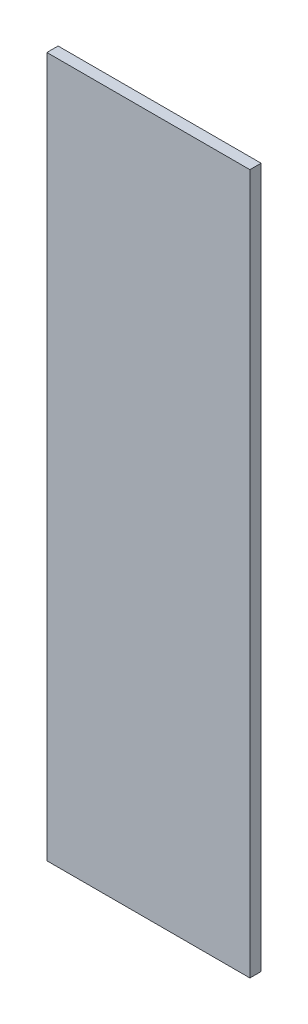
ISO-10303-21;
HEADER;
FILE_DESCRIPTION(('STEP AP214'),'2;1');
FILE_NAME('part.step','',(''),(''),'','','');
FILE_SCHEMA(('AUTOMOTIVE_DESIGN { 1 0 10303 214 1 1 1 1 }'));
ENDSEC;
DATA;
#1=APPLICATION_CONTEXT('core data for automotive mechanical design processes');
#2=APPLICATION_PROTOCOL_DEFINITION('international standard','automotive_design',2000,#1);
#3=PRODUCT_CONTEXT('',#1,'mechanical');
#4=PRODUCT('Part','Part','',(#3));
#5=PRODUCT_RELATED_PRODUCT_CATEGORY('part','',(#4));
#6=PRODUCT_DEFINITION_FORMATION('','',#4);
#7=PRODUCT_DEFINITION_CONTEXT('part definition',#1,'design');
#8=PRODUCT_DEFINITION('design','',#6,#7);
#9=PRODUCT_DEFINITION_SHAPE('','',#8);
#10=(LENGTH_UNIT() NAMED_UNIT(*) SI_UNIT(.MILLI.,.METRE.));
#11=(NAMED_UNIT(*) PLANE_ANGLE_UNIT() SI_UNIT($,.RADIAN.));
#12=(NAMED_UNIT(*) SI_UNIT($,.STERADIAN.) SOLID_ANGLE_UNIT());
#13=UNCERTAINTY_MEASURE_WITH_UNIT(LENGTH_MEASURE(1.E-05),#10,'distance_accuracy_value','');
#14=(GEOMETRIC_REPRESENTATION_CONTEXT(3) GLOBAL_UNCERTAINTY_ASSIGNED_CONTEXT((#13)) GLOBAL_UNIT_ASSIGNED_CONTEXT((#10,
#11,#12)) REPRESENTATION_CONTEXT('',''));
#15=CARTESIAN_POINT('',(0.,0.,0.));
#16=DIRECTION('',(0.,0.,1.));
#17=DIRECTION('',(1.,0.,0.));
#18=AXIS2_PLACEMENT_3D('',#15,#16,#17);
#19=CARTESIAN_POINT('',(0.,0.,1.6));
#20=DIRECTION('',(1.,0.,0.));
#21=DIRECTION('',(0.,1.,0.));
#22=AXIS2_PLACEMENT_3D('',#19,#20,#21);
#23=PLANE('',#22);
#24=DIRECTION('',(0.,-1.,0.));
#25=VECTOR('',#24,1.);
#26=CARTESIAN_POINT('',(0.,0.,0.));
#27=LINE('',#26,#25);
#28=CARTESIAN_POINT('',(0.,100.,0.));
#29=VERTEX_POINT('',#28);
#30=CARTESIAN_POINT('',(0.,0.,0.));
#31=VERTEX_POINT('',#30);
#32=EDGE_CURVE('E99',#29,#31,#27,.T.);
#33=ORIENTED_EDGE('',*,*,#32,.T.);
#34=DIRECTION('',(0.,0.,-1.));
#35=VECTOR('',#34,1.);
#36=CARTESIAN_POINT('',(0.,0.,1.6));
#37=LINE('',#36,#35);
#38=CARTESIAN_POINT('',(0.,0.,1.6));
#39=VERTEX_POINT('',#38);
#40=EDGE_CURVE('E11',#39,#31,#37,.T.);
#41=ORIENTED_EDGE('',*,*,#40,.F.);
#42=DIRECTION('',(0.,-1.,0.));
#43=VECTOR('',#42,1.);
#44=CARTESIAN_POINT('',(0.,0.,1.6));
#45=LINE('',#44,#43);
#46=CARTESIAN_POINT('',(0.,100.,1.6));
#47=VERTEX_POINT('',#46);
#48=EDGE_CURVE('E87',#47,#39,#45,.T.);
#49=ORIENTED_EDGE('',*,*,#48,.F.);
#50=DIRECTION('',(0.,0.,-1.));
#51=VECTOR('',#50,1.);
#52=CARTESIAN_POINT('',(0.,100.,1.6));
#53=LINE('',#52,#51);
#54=EDGE_CURVE('E95',#47,#29,#53,.T.);
#55=ORIENTED_EDGE('',*,*,#54,.T.);
#56=EDGE_LOOP('',(#33,#41,#49,#55));
#57=FACE_BOUND('',#56,.T.);
#58=ADVANCED_FACE('F36',(#57),#23,.F.);
#59=CARTESIAN_POINT('',(0.,0.,1.6));
#60=DIRECTION('',(0.,1.,0.));
#61=DIRECTION('',(0.,0.,1.));
#62=AXIS2_PLACEMENT_3D('',#59,#60,#61);
#63=PLANE('',#62);
#64=DIRECTION('',(1.,0.,0.));
#65=VECTOR('',#64,1.);
#66=CARTESIAN_POINT('',(0.,0.,0.));
#67=LINE('',#66,#65);
#68=CARTESIAN_POINT('',(29.,0.,0.));
#69=VERTEX_POINT('',#68);
#70=EDGE_CURVE('E91',#31,#69,#67,.T.);
#71=ORIENTED_EDGE('',*,*,#70,.T.);
#72=DIRECTION('',(0.,0.,-1.));
#73=VECTOR('',#72,1.);
#74=CARTESIAN_POINT('',(29.,0.,1.6));
#75=LINE('',#74,#73);
#76=CARTESIAN_POINT('',(29.,0.,1.6));
#77=VERTEX_POINT('',#76);
#78=EDGE_CURVE('E44',#77,#69,#75,.T.);
#79=ORIENTED_EDGE('',*,*,#78,.F.);
#80=DIRECTION('',(1.,0.,0.));
#81=VECTOR('',#80,1.);
#82=CARTESIAN_POINT('',(0.,0.,1.6));
#83=LINE('',#82,#81);
#84=EDGE_CURVE('E82',#39,#77,#83,.T.);
#85=ORIENTED_EDGE('',*,*,#84,.F.);
#86=ORIENTED_EDGE('',*,*,#40,.T.);
#87=EDGE_LOOP('',(#71,#79,#85,#86));
#88=FACE_BOUND('',#87,.T.);
#89=ADVANCED_FACE('F90',(#88),#63,.F.);
#90=CARTESIAN_POINT('',(29.,0.,1.6));
#91=DIRECTION('',(-1.,0.,0.));
#92=DIRECTION('',(0.,-1.,0.));
#93=AXIS2_PLACEMENT_3D('',#90,#91,#92);
#94=PLANE('',#93);
#95=DIRECTION('',(0.,1.,0.));
#96=VECTOR('',#95,1.);
#97=CARTESIAN_POINT('',(29.,0.,0.));
#98=LINE('',#97,#96);
#99=CARTESIAN_POINT('',(29.,100.,0.));
#100=VERTEX_POINT('',#99);
#101=EDGE_CURVE('E69',#69,#100,#98,.T.);
#102=ORIENTED_EDGE('',*,*,#101,.T.);
#103=DIRECTION('',(0.,0.,-1.));
#104=VECTOR('',#103,1.);
#105=CARTESIAN_POINT('',(29.,100.,1.6));
#106=LINE('',#105,#104);
#107=CARTESIAN_POINT('',(29.,100.,1.6));
#108=VERTEX_POINT('',#107);
#109=EDGE_CURVE('E92',#108,#100,#106,.T.);
#110=ORIENTED_EDGE('',*,*,#109,.F.);
#111=DIRECTION('',(0.,1.,0.));
#112=VECTOR('',#111,1.);
#113=CARTESIAN_POINT('',(29.,0.,1.6));
#114=LINE('',#113,#112);
#115=EDGE_CURVE('E85',#77,#108,#114,.T.);
#116=ORIENTED_EDGE('',*,*,#115,.F.);
#117=ORIENTED_EDGE('',*,*,#78,.T.);
#118=EDGE_LOOP('',(#102,#110,#116,#117));
#119=FACE_BOUND('',#118,.T.);
#120=ADVANCED_FACE('F93',(#119),#94,.F.);
#121=CARTESIAN_POINT('',(0.,100.,1.6));
#122=DIRECTION('',(0.,-1.,0.));
#123=DIRECTION('',(0.,0.,-1.));
#124=AXIS2_PLACEMENT_3D('',#121,#122,#123);
#125=PLANE('',#124);
#126=DIRECTION('',(-1.,0.,0.));
#127=VECTOR('',#126,1.);
#128=CARTESIAN_POINT('',(0.,100.,0.));
#129=LINE('',#128,#127);
#130=EDGE_CURVE('E75',#100,#29,#129,.T.);
#131=ORIENTED_EDGE('',*,*,#130,.T.);
#132=ORIENTED_EDGE('',*,*,#54,.F.);
#133=DIRECTION('',(-1.,0.,0.));
#134=VECTOR('',#133,1.);
#135=CARTESIAN_POINT('',(0.,100.,1.6));
#136=LINE('',#135,#134);
#137=EDGE_CURVE('E52',#108,#47,#136,.T.);
#138=ORIENTED_EDGE('',*,*,#137,.F.);
#139=ORIENTED_EDGE('',*,*,#109,.T.);
#140=EDGE_LOOP('',(#131,#132,#138,#139));
#141=FACE_BOUND('',#140,.T.);
#142=ADVANCED_FACE('F106',(#141),#125,.F.);
#143=CARTESIAN_POINT('',(0.,0.,1.6));
#144=DIRECTION('',(0.,0.,-1.));
#145=DIRECTION('',(-1.,0.,0.));
#146=AXIS2_PLACEMENT_3D('',#143,#144,#145);
#147=PLANE('',#146);
#148=ORIENTED_EDGE('',*,*,#48,.T.);
#149=ORIENTED_EDGE('',*,*,#84,.T.);
#150=ORIENTED_EDGE('',*,*,#115,.T.);
#151=ORIENTED_EDGE('',*,*,#137,.T.);
#152=EDGE_LOOP('',(#148,#149,#150,#151));
#153=FACE_BOUND('',#152,.T.);
#154=ADVANCED_FACE('F83',(#153),#147,.F.);
#155=CARTESIAN_POINT('',(0.,0.,0.));
#156=DIRECTION('',(0.,0.,-1.));
#157=DIRECTION('',(-1.,0.,0.));
#158=AXIS2_PLACEMENT_3D('',#155,#156,#157);
#159=PLANE('',#158);
#160=ORIENTED_EDGE('',*,*,#32,.F.);
#161=ORIENTED_EDGE('',*,*,#130,.F.);
#162=ORIENTED_EDGE('',*,*,#101,.F.);
#163=ORIENTED_EDGE('',*,*,#70,.F.);
#164=EDGE_LOOP('',(#160,#161,#162,#163));
#165=FACE_BOUND('',#164,.T.);
#166=ADVANCED_FACE('F109',(#165),#159,.T.);
#167=CLOSED_SHELL('',(#58,#89,#120,#142,#154,#166));
#168=MANIFOLD_SOLID_BREP('B2',#167);
#169=ADVANCED_BREP_SHAPE_REPRESENTATION('',(#18,#168),#14);
#170=SHAPE_DEFINITION_REPRESENTATION(#9,#169);
ENDSEC;
END-ISO-10303-21;
